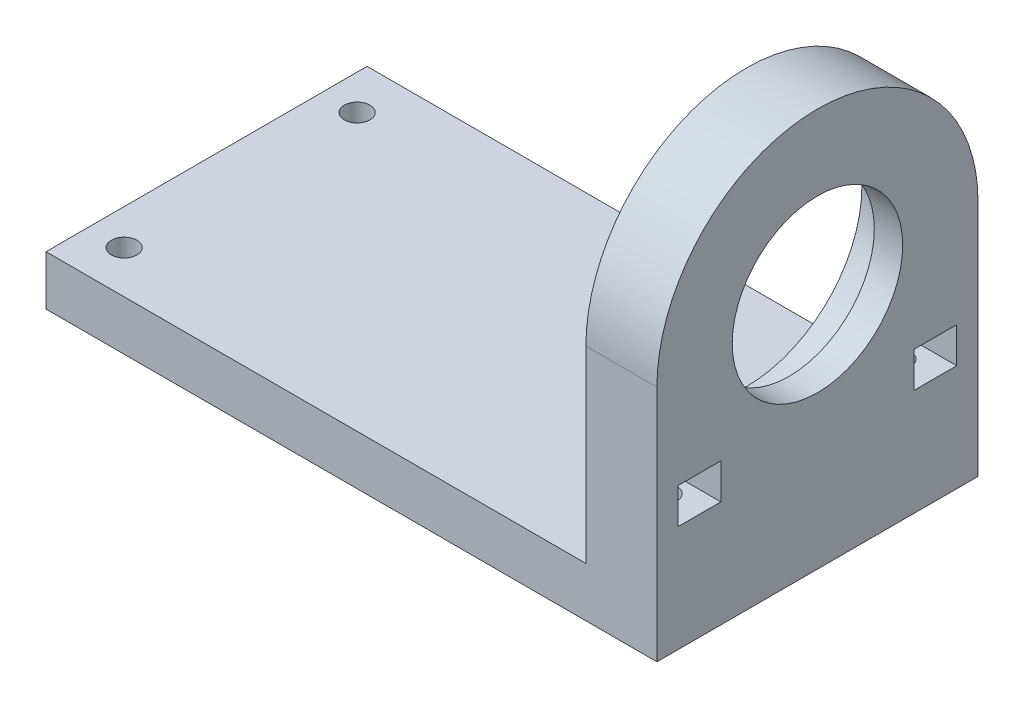
ISO-10303-21;
HEADER;
FILE_DESCRIPTION(('STEP AP214'),'2;1');
FILE_NAME('part.step','',(''),(''),'','','');
FILE_SCHEMA(('AUTOMOTIVE_DESIGN { 1 0 10303 214 1 1 1 1 }'));
ENDSEC;
DATA;
#1=APPLICATION_CONTEXT('core data for automotive mechanical design processes');
#2=APPLICATION_PROTOCOL_DEFINITION('international standard','automotive_design',2000,#1);
#3=PRODUCT_CONTEXT('',#1,'mechanical');
#4=PRODUCT('Part','Part','',(#3));
#5=PRODUCT_RELATED_PRODUCT_CATEGORY('part','',(#4));
#6=PRODUCT_DEFINITION_FORMATION('','',#4);
#7=PRODUCT_DEFINITION_CONTEXT('part definition',#1,'design');
#8=PRODUCT_DEFINITION('design','',#6,#7);
#9=PRODUCT_DEFINITION_SHAPE('','',#8);
#10=(LENGTH_UNIT() NAMED_UNIT(*) SI_UNIT(.MILLI.,.METRE.));
#11=(NAMED_UNIT(*) PLANE_ANGLE_UNIT() SI_UNIT($,.RADIAN.));
#12=(NAMED_UNIT(*) SI_UNIT($,.STERADIAN.) SOLID_ANGLE_UNIT());
#13=UNCERTAINTY_MEASURE_WITH_UNIT(LENGTH_MEASURE(1.E-05),#10,'distance_accuracy_value','');
#14=(GEOMETRIC_REPRESENTATION_CONTEXT(3) GLOBAL_UNCERTAINTY_ASSIGNED_CONTEXT((#13)) GLOBAL_UNIT_ASSIGNED_CONTEXT((#10,
#11,#12)) REPRESENTATION_CONTEXT('',''));
#15=CARTESIAN_POINT('',(0.,0.,0.));
#16=DIRECTION('',(0.,0.,1.));
#17=DIRECTION('',(1.,0.,0.));
#18=AXIS2_PLACEMENT_3D('',#15,#16,#17);
#19=CARTESIAN_POINT('',(-38.0669193591551,20.,-12.8700518012771));
#20=DIRECTION('',(0.,-1.,0.));
#21=DIRECTION('',(0.,0.,-1.));
#22=AXIS2_PLACEMENT_3D('',#19,#20,#21);
#23=CYLINDRICAL_SURFACE('',#22,1.8);
#24=CARTESIAN_POINT('',(-38.0669193591551,7.,-12.8700518012771));
#25=DIRECTION('',(0.,-1.,0.));
#26=DIRECTION('',(0.,0.,-1.));
#27=AXIS2_PLACEMENT_3D('',#24,#25,#26);
#28=CIRCLE('',#27,1.8);
#29=CARTESIAN_POINT('',(-38.0669193591551,7.,-14.6700518012771));
#30=VERTEX_POINT('',#29);
#31=EDGE_CURVE('E333',#30,#30,#28,.T.);
#32=ORIENTED_EDGE('',*,*,#31,.F.);
#33=EDGE_LOOP('',(#32));
#34=FACE_BOUND('',#33,.T.);
#35=CARTESIAN_POINT('',(-38.0669193591551,3.5,-12.8700518012771));
#36=DIRECTION('',(0.,-1.,0.));
#37=DIRECTION('',(0.,0.,-1.));
#38=AXIS2_PLACEMENT_3D('',#35,#36,#37);
#39=CIRCLE('',#38,1.8);
#40=CARTESIAN_POINT('',(-38.0669193591551,3.5,-14.6700518012771));
#41=VERTEX_POINT('',#40);
#42=EDGE_CURVE('E45',#41,#41,#39,.F.);
#43=ORIENTED_EDGE('',*,*,#42,.F.);
#44=EDGE_LOOP('',(#43));
#45=FACE_BOUND('',#44,.T.);
#46=ADVANCED_FACE('F41',(#34,#45),#23,.F.);
#47=CARTESIAN_POINT('',(38.0669193591551,20.,-12.8700518012771));
#48=DIRECTION('',(0.,-1.,0.));
#49=DIRECTION('',(0.,0.,-1.));
#50=AXIS2_PLACEMENT_3D('',#47,#48,#49);
#51=CYLINDRICAL_SURFACE('',#50,1.8);
#52=CARTESIAN_POINT('',(38.0669193591551,15.,-12.8700518012771));
#53=DIRECTION('',(0.,-1.,0.));
#54=DIRECTION('',(0.,0.,-1.));
#55=AXIS2_PLACEMENT_3D('',#52,#53,#54);
#56=CIRCLE('',#55,1.8);
#57=CARTESIAN_POINT('',(38.0669193591551,15.,-14.6700518012771));
#58=VERTEX_POINT('',#57);
#59=EDGE_CURVE('E315',#58,#58,#56,.F.);
#60=ORIENTED_EDGE('',*,*,#59,.T.);
#61=EDGE_LOOP('',(#60));
#62=FACE_BOUND('',#61,.T.);
#63=CARTESIAN_POINT('',(38.0669193591551,3.5,-12.8700518012771));
#64=DIRECTION('',(0.,-1.,0.));
#65=DIRECTION('',(0.,0.,-1.));
#66=AXIS2_PLACEMENT_3D('',#63,#64,#65);
#67=CIRCLE('',#66,1.8);
#68=CARTESIAN_POINT('',(38.0669193591551,3.5,-14.6700518012771));
#69=VERTEX_POINT('',#68);
#70=EDGE_CURVE('E320',#69,#69,#67,.T.);
#71=ORIENTED_EDGE('',*,*,#70,.T.);
#72=EDGE_LOOP('',(#71));
#73=FACE_BOUND('',#72,.T.);
#74=ADVANCED_FACE('F401',(#62,#73),#51,.F.);
#75=CARTESIAN_POINT('',(33.,33.5,3.4));
#76=DIRECTION('',(1.,0.,0.));
#77=DIRECTION('',(0.,0.,-1.));
#78=AXIS2_PLACEMENT_3D('',#75,#76,#77);
#79=CYLINDRICAL_SURFACE('',#78,12.);
#80=CARTESIAN_POINT('',(43.,33.5,3.4));
#81=DIRECTION('',(1.,0.,0.));
#82=DIRECTION('',(0.,0.,-1.));
#83=AXIS2_PLACEMENT_3D('',#80,#81,#82);
#84=CIRCLE('',#83,12.);
#85=CARTESIAN_POINT('',(43.,33.5,-8.6));
#86=VERTEX_POINT('',#85);
#87=EDGE_CURVE('E237',#86,#86,#84,.T.);
#88=ORIENTED_EDGE('',*,*,#87,.T.);
#89=EDGE_LOOP('',(#88));
#90=FACE_BOUND('',#89,.T.);
#91=CARTESIAN_POINT('',(39.,33.5,3.4));
#92=DIRECTION('',(-1.,0.,0.));
#93=DIRECTION('',(0.,0.,1.));
#94=AXIS2_PLACEMENT_3D('',#91,#92,#93);
#95=CIRCLE('',#94,12.);
#96=CARTESIAN_POINT('',(39.,33.5,15.4));
#97=VERTEX_POINT('',#96);
#98=EDGE_CURVE('E188',#97,#97,#95,.F.);
#99=ORIENTED_EDGE('',*,*,#98,.F.);
#100=EDGE_LOOP('',(#99));
#101=FACE_BOUND('',#100,.T.);
#102=ADVANCED_FACE('F407',(#90,#101),#79,.F.);
#103=CARTESIAN_POINT('',(0.,7.,0.));
#104=DIRECTION('',(0.,-1.,0.));
#105=DIRECTION('',(0.,0.,-1.));
#106=AXIS2_PLACEMENT_3D('',#103,#104,#105);
#107=PLANE('',#106);
#108=CARTESIAN_POINT('',(-38.,7.,20.));
#109=DIRECTION('',(0.,-1.,0.));
#110=DIRECTION('',(0.,0.,-1.));
#111=AXIS2_PLACEMENT_3D('',#108,#109,#110);
#112=CIRCLE('',#111,1.8);
#113=CARTESIAN_POINT('',(-38.,7.,18.2));
#114=VERTEX_POINT('',#113);
#115=EDGE_CURVE('E354',#114,#114,#112,.T.);
#116=ORIENTED_EDGE('',*,*,#115,.T.);
#117=EDGE_LOOP('',(#116));
#118=FACE_BOUND('',#117,.T.);
#119=ORIENTED_EDGE('',*,*,#31,.T.);
#120=EDGE_LOOP('',(#119));
#121=FACE_BOUND('',#120,.T.);
#122=DIRECTION('',(0.,0.,1.));
#123=VECTOR('',#122,1.);
#124=CARTESIAN_POINT('',(33.,7.,0.));
#125=LINE('',#124,#123);
#126=CARTESIAN_POINT('',(33.,7.,-19.2));
#127=VERTEX_POINT('',#126);
#128=CARTESIAN_POINT('',(33.,7.,26.));
#129=VERTEX_POINT('',#128);
#130=EDGE_CURVE('E59',#127,#129,#125,.T.);
#131=ORIENTED_EDGE('',*,*,#130,.F.);
#132=DIRECTION('',(-1.,0.,0.));
#133=VECTOR('',#132,1.);
#134=CARTESIAN_POINT('',(-43.,7.,-19.2));
#135=LINE('',#134,#133);
#136=CARTESIAN_POINT('',(-43.,7.,-19.2));
#137=VERTEX_POINT('',#136);
#138=EDGE_CURVE('E282',#127,#137,#135,.T.);
#139=ORIENTED_EDGE('',*,*,#138,.T.);
#140=DIRECTION('',(0.,0.,1.));
#141=VECTOR('',#140,1.);
#142=CARTESIAN_POINT('',(-43.,7.,26.));
#143=LINE('',#142,#141);
#144=CARTESIAN_POINT('',(-43.,7.,26.));
#145=VERTEX_POINT('',#144);
#146=EDGE_CURVE('E276',#137,#145,#143,.T.);
#147=ORIENTED_EDGE('',*,*,#146,.T.);
#148=DIRECTION('',(1.,0.,0.));
#149=VECTOR('',#148,1.);
#150=CARTESIAN_POINT('',(-43.,7.,26.));
#151=LINE('',#150,#149);
#152=EDGE_CURVE('E64',#145,#129,#151,.T.);
#153=ORIENTED_EDGE('',*,*,#152,.T.);
#154=EDGE_LOOP('',(#131,#139,#147,#153));
#155=FACE_BOUND('',#154,.T.);
#156=ADVANCED_FACE('F469',(#118,#121,#155),#107,.F.);
#157=CARTESIAN_POINT('',(-43.,7.,26.));
#158=DIRECTION('',(1.,0.,0.));
#159=DIRECTION('',(0.,0.,-1.));
#160=AXIS2_PLACEMENT_3D('',#157,#158,#159);
#161=PLANE('',#160);
#162=DIRECTION('',(0.,0.,1.));
#163=VECTOR('',#162,1.);
#164=CARTESIAN_POINT('',(-43.,0.,26.));
#165=LINE('',#164,#163);
#166=CARTESIAN_POINT('',(-43.,0.,-19.2));
#167=VERTEX_POINT('',#166);
#168=CARTESIAN_POINT('',(-43.,0.,26.));
#169=VERTEX_POINT('',#168);
#170=EDGE_CURVE('E275',#167,#169,#165,.T.);
#171=ORIENTED_EDGE('',*,*,#170,.T.);
#172=DIRECTION('',(0.,-1.,0.));
#173=VECTOR('',#172,1.);
#174=CARTESIAN_POINT('',(-43.,7.,26.));
#175=LINE('',#174,#173);
#176=EDGE_CURVE('E11',#145,#169,#175,.T.);
#177=ORIENTED_EDGE('',*,*,#176,.F.);
#178=ORIENTED_EDGE('',*,*,#146,.F.);
#179=DIRECTION('',(0.,-1.,0.));
#180=VECTOR('',#179,1.);
#181=CARTESIAN_POINT('',(-43.,7.,-19.2));
#182=LINE('',#181,#180);
#183=EDGE_CURVE('E285',#137,#167,#182,.T.);
#184=ORIENTED_EDGE('',*,*,#183,.T.);
#185=EDGE_LOOP('',(#171,#177,#178,#184));
#186=FACE_BOUND('',#185,.T.);
#187=ADVANCED_FACE('F43',(#186),#161,.F.);
#188=CARTESIAN_POINT('',(-43.,7.,26.));
#189=DIRECTION('',(0.,0.,-1.));
#190=DIRECTION('',(-1.,0.,0.));
#191=AXIS2_PLACEMENT_3D('',#188,#189,#190);
#192=PLANE('',#191);
#193=DIRECTION('',(0.,-1.,0.));
#194=VECTOR('',#193,1.);
#195=CARTESIAN_POINT('',(43.,7.,26.));
#196=LINE('',#195,#194);
#197=CARTESIAN_POINT('',(43.,33.5,26.));
#198=VERTEX_POINT('',#197);
#199=CARTESIAN_POINT('',(43.,0.,26.));
#200=VERTEX_POINT('',#199);
#201=EDGE_CURVE('E51',#198,#200,#196,.T.);
#202=ORIENTED_EDGE('',*,*,#201,.F.);
#203=DIRECTION('',(1.,0.,0.));
#204=VECTOR('',#203,1.);
#205=CARTESIAN_POINT('',(33.,33.5,26.));
#206=LINE('',#205,#204);
#207=CARTESIAN_POINT('',(33.,33.5,26.));
#208=VERTEX_POINT('',#207);
#209=EDGE_CURVE('E266',#208,#198,#206,.T.);
#210=ORIENTED_EDGE('',*,*,#209,.F.);
#211=DIRECTION('',(0.,-1.,0.));
#212=VECTOR('',#211,1.);
#213=CARTESIAN_POINT('',(33.,0.,26.));
#214=LINE('',#213,#212);
#215=EDGE_CURVE('E258',#208,#129,#214,.T.);
#216=ORIENTED_EDGE('',*,*,#215,.T.);
#217=ORIENTED_EDGE('',*,*,#152,.F.);
#218=ORIENTED_EDGE('',*,*,#176,.T.);
#219=DIRECTION('',(1.,0.,0.));
#220=VECTOR('',#219,1.);
#221=CARTESIAN_POINT('',(-43.,0.,26.));
#222=LINE('',#221,#220);
#223=EDGE_CURVE('E289',#169,#200,#222,.T.);
#224=ORIENTED_EDGE('',*,*,#223,.T.);
#225=EDGE_LOOP('',(#202,#210,#216,#217,#218,#224));
#226=FACE_BOUND('',#225,.T.);
#227=ADVANCED_FACE('F484',(#226),#192,.F.);
#228=CARTESIAN_POINT('',(43.,7.,26.));
#229=DIRECTION('',(-1.,0.,0.));
#230=DIRECTION('',(0.,0.,1.));
#231=AXIS2_PLACEMENT_3D('',#228,#229,#230);
#232=PLANE('',#231);
#233=DIRECTION('',(0.,0.,-1.));
#234=VECTOR('',#233,1.);
#235=CARTESIAN_POINT('',(43.,0.,26.));
#236=LINE('',#235,#234);
#237=CARTESIAN_POINT('',(43.,0.,-19.2));
#238=VERTEX_POINT('',#237);
#239=EDGE_CURVE('E292',#200,#238,#236,.T.);
#240=ORIENTED_EDGE('',*,*,#239,.T.);
#241=DIRECTION('',(0.,-1.,0.));
#242=VECTOR('',#241,1.);
#243=CARTESIAN_POINT('',(43.,7.,-19.2));
#244=LINE('',#243,#242);
#245=CARTESIAN_POINT('',(43.,33.5,-19.2));
#246=VERTEX_POINT('',#245);
#247=EDGE_CURVE('E300',#246,#238,#244,.T.);
#248=ORIENTED_EDGE('',*,*,#247,.F.);
#249=CARTESIAN_POINT('',(43.,33.5,3.4));
#250=DIRECTION('',(1.,0.,0.));
#251=DIRECTION('',(0.,0.,-1.));
#252=AXIS2_PLACEMENT_3D('',#249,#250,#251);
#253=CIRCLE('',#252,22.6);
#254=EDGE_CURVE('E250',#246,#198,#253,.T.);
#255=ORIENTED_EDGE('',*,*,#254,.T.);
#256=ORIENTED_EDGE('',*,*,#201,.T.);
#257=EDGE_LOOP('',(#240,#248,#255,#256));
#258=FACE_BOUND('',#257,.T.);
#259=ORIENTED_EDGE('',*,*,#87,.F.);
#260=EDGE_LOOP('',(#259));
#261=FACE_BOUND('',#260,.T.);
#262=DIRECTION('',(0.,-1.,0.));
#263=VECTOR('',#262,1.);
#264=CARTESIAN_POINT('',(43.,15.,23.));
#265=LINE('',#264,#263);
#266=CARTESIAN_POINT('',(43.,20.,23.));
#267=VERTEX_POINT('',#266);
#268=CARTESIAN_POINT('',(43.,15.,23.));
#269=VERTEX_POINT('',#268);
#270=EDGE_CURVE('E197',#267,#269,#265,.T.);
#271=ORIENTED_EDGE('',*,*,#270,.F.);
#272=DIRECTION('',(0.,0.,1.));
#273=VECTOR('',#272,1.);
#274=CARTESIAN_POINT('',(43.,20.,23.));
#275=LINE('',#274,#273);
#276=CARTESIAN_POINT('',(43.,20.,17.));
#277=VERTEX_POINT('',#276);
#278=EDGE_CURVE('E208',#277,#267,#275,.T.);
#279=ORIENTED_EDGE('',*,*,#278,.F.);
#280=DIRECTION('',(0.,1.,0.));
#281=VECTOR('',#280,1.);
#282=CARTESIAN_POINT('',(43.,15.,17.));
#283=LINE('',#282,#281);
#284=CARTESIAN_POINT('',(43.,15.,17.));
#285=VERTEX_POINT('',#284);
#286=EDGE_CURVE('E227',#285,#277,#283,.T.);
#287=ORIENTED_EDGE('',*,*,#286,.F.);
#288=DIRECTION('',(0.,0.,-1.));
#289=VECTOR('',#288,1.);
#290=CARTESIAN_POINT('',(43.,15.,23.));
#291=LINE('',#290,#289);
#292=EDGE_CURVE('E223',#269,#285,#291,.T.);
#293=ORIENTED_EDGE('',*,*,#292,.F.);
#294=EDGE_LOOP('',(#271,#279,#287,#293));
#295=FACE_BOUND('',#294,.T.);
#296=DIRECTION('',(0.,1.,0.));
#297=VECTOR('',#296,1.);
#298=CARTESIAN_POINT('',(43.,15.,-16.2));
#299=LINE('',#298,#297);
#300=CARTESIAN_POINT('',(43.,15.,-16.2));
#301=VERTEX_POINT('',#300);
#302=CARTESIAN_POINT('',(43.,20.,-16.2));
#303=VERTEX_POINT('',#302);
#304=EDGE_CURVE('E150',#301,#303,#299,.T.);
#305=ORIENTED_EDGE('',*,*,#304,.F.);
#306=DIRECTION('',(0.,0.,-1.));
#307=VECTOR('',#306,1.);
#308=CARTESIAN_POINT('',(43.,15.,-16.2));
#309=LINE('',#308,#307);
#310=CARTESIAN_POINT('',(43.,15.,-10.2));
#311=VERTEX_POINT('',#310);
#312=EDGE_CURVE('E171',#311,#301,#309,.T.);
#313=ORIENTED_EDGE('',*,*,#312,.F.);
#314=DIRECTION('',(0.,-1.,0.));
#315=VECTOR('',#314,1.);
#316=CARTESIAN_POINT('',(43.,15.,-10.2));
#317=LINE('',#316,#315);
#318=CARTESIAN_POINT('',(43.,20.,-10.2));
#319=VERTEX_POINT('',#318);
#320=EDGE_CURVE('E175',#319,#311,#317,.T.);
#321=ORIENTED_EDGE('',*,*,#320,.F.);
#322=DIRECTION('',(0.,0.,1.));
#323=VECTOR('',#322,1.);
#324=CARTESIAN_POINT('',(43.,20.,-16.2));
#325=LINE('',#324,#323);
#326=EDGE_CURVE('E187',#303,#319,#325,.T.);
#327=ORIENTED_EDGE('',*,*,#326,.F.);
#328=EDGE_LOOP('',(#305,#313,#321,#327));
#329=FACE_BOUND('',#328,.T.);
#330=ADVANCED_FACE('F481',(#258,#261,#295,#329),#232,.F.);
#331=CARTESIAN_POINT('',(-43.,7.,-19.2));
#332=DIRECTION('',(0.,0.,1.));
#333=DIRECTION('',(1.,0.,0.));
#334=AXIS2_PLACEMENT_3D('',#331,#332,#333);
#335=PLANE('',#334);
#336=DIRECTION('',(-1.,0.,0.));
#337=VECTOR('',#336,1.);
#338=CARTESIAN_POINT('',(-43.,0.,-19.2));
#339=LINE('',#338,#337);
#340=EDGE_CURVE('E279',#238,#167,#339,.T.);
#341=ORIENTED_EDGE('',*,*,#340,.T.);
#342=ORIENTED_EDGE('',*,*,#183,.F.);
#343=ORIENTED_EDGE('',*,*,#138,.F.);
#344=DIRECTION('',(0.,1.,0.));
#345=VECTOR('',#344,1.);
#346=CARTESIAN_POINT('',(33.,0.,-19.2));
#347=LINE('',#346,#345);
#348=CARTESIAN_POINT('',(33.,33.5,-19.2));
#349=VERTEX_POINT('',#348);
#350=EDGE_CURVE('E251',#127,#349,#347,.T.);
#351=ORIENTED_EDGE('',*,*,#350,.T.);
#352=DIRECTION('',(1.,0.,0.));
#353=VECTOR('',#352,1.);
#354=CARTESIAN_POINT('',(33.,33.5,-19.2));
#355=LINE('',#354,#353);
#356=EDGE_CURVE('E262',#349,#246,#355,.T.);
#357=ORIENTED_EDGE('',*,*,#356,.T.);
#358=ORIENTED_EDGE('',*,*,#247,.T.);
#359=EDGE_LOOP('',(#341,#342,#343,#351,#357,#358));
#360=FACE_BOUND('',#359,.T.);
#361=ADVANCED_FACE('F396',(#360),#335,.F.);
#362=CARTESIAN_POINT('',(0.,0.,0.));
#363=DIRECTION('',(0.,-1.,0.));
#364=DIRECTION('',(0.,0.,-1.));
#365=AXIS2_PLACEMENT_3D('',#362,#363,#364);
#366=PLANE('',#365);
#367=CARTESIAN_POINT('',(-38.,0.,20.));
#368=DIRECTION('',(0.,-1.,0.));
#369=DIRECTION('',(0.,0.,1.));
#370=AXIS2_PLACEMENT_3D('',#367,#368,#369);
#371=CIRCLE('',#370,3.5);
#372=CARTESIAN_POINT('',(-38.,0.,23.5));
#373=VERTEX_POINT('',#372);
#374=EDGE_CURVE('E335',#373,#373,#371,.T.);
#375=ORIENTED_EDGE('',*,*,#374,.F.);
#376=EDGE_LOOP('',(#375));
#377=FACE_BOUND('',#376,.T.);
#378=CARTESIAN_POINT('',(-38.,0.,-13.2));
#379=DIRECTION('',(0.,-1.,0.));
#380=DIRECTION('',(0.,0.,-1.));
#381=AXIS2_PLACEMENT_3D('',#378,#379,#380);
#382=CIRCLE('',#381,3.5);
#383=CARTESIAN_POINT('',(-38.,0.,-16.7));
#384=VERTEX_POINT('',#383);
#385=EDGE_CURVE('E347',#384,#384,#382,.T.);
#386=ORIENTED_EDGE('',*,*,#385,.F.);
#387=EDGE_LOOP('',(#386));
#388=FACE_BOUND('',#387,.T.);
#389=CARTESIAN_POINT('',(38.,0.,20.));
#390=DIRECTION('',(0.,1.,0.));
#391=DIRECTION('',(0.,0.,1.));
#392=AXIS2_PLACEMENT_3D('',#389,#390,#391);
#393=CIRCLE('',#392,3.5);
#394=CARTESIAN_POINT('',(38.,0.,23.5));
#395=VERTEX_POINT('',#394);
#396=EDGE_CURVE('E362',#395,#395,#393,.T.);
#397=ORIENTED_EDGE('',*,*,#396,.T.);
#398=EDGE_LOOP('',(#397));
#399=FACE_BOUND('',#398,.T.);
#400=CARTESIAN_POINT('',(38.,0.,-13.2));
#401=DIRECTION('',(0.,1.,0.));
#402=DIRECTION('',(0.,0.,-1.));
#403=AXIS2_PLACEMENT_3D('',#400,#401,#402);
#404=CIRCLE('',#403,3.5);
#405=CARTESIAN_POINT('',(38.,0.,-16.7));
#406=VERTEX_POINT('',#405);
#407=EDGE_CURVE('E358',#406,#406,#404,.T.);
#408=ORIENTED_EDGE('',*,*,#407,.T.);
#409=EDGE_LOOP('',(#408));
#410=FACE_BOUND('',#409,.T.);
#411=ORIENTED_EDGE('',*,*,#239,.F.);
#412=ORIENTED_EDGE('',*,*,#223,.F.);
#413=ORIENTED_EDGE('',*,*,#170,.F.);
#414=ORIENTED_EDGE('',*,*,#340,.F.);
#415=EDGE_LOOP('',(#411,#412,#413,#414));
#416=FACE_BOUND('',#415,.T.);
#417=ADVANCED_FACE('F387',(#377,#388,#399,#410,#416),#366,.T.);
#418=CARTESIAN_POINT('',(33.,33.5,3.4));
#419=DIRECTION('',(1.,0.,0.));
#420=DIRECTION('',(0.,0.,-1.));
#421=AXIS2_PLACEMENT_3D('',#418,#419,#420);
#422=PLANE('',#421);
#423=CARTESIAN_POINT('',(33.,33.5,3.4));
#424=DIRECTION('',(-1.,0.,0.));
#425=DIRECTION('',(0.,0.,1.));
#426=AXIS2_PLACEMENT_3D('',#423,#424,#425);
#427=CIRCLE('',#426,16.25);
#428=CARTESIAN_POINT('',(33.,33.5,19.65));
#429=VERTEX_POINT('',#428);
#430=EDGE_CURVE('E178',#429,#429,#427,.T.);
#431=ORIENTED_EDGE('',*,*,#430,.F.);
#432=EDGE_LOOP('',(#431));
#433=FACE_BOUND('',#432,.T.);
#434=DIRECTION('',(0.,0.,-1.));
#435=VECTOR('',#434,1.);
#436=CARTESIAN_POINT('',(33.,15.,-16.2));
#437=LINE('',#436,#435);
#438=CARTESIAN_POINT('',(33.,15.,-10.2));
#439=VERTEX_POINT('',#438);
#440=CARTESIAN_POINT('',(33.,15.,-16.2));
#441=VERTEX_POINT('',#440);
#442=EDGE_CURVE('E156',#439,#441,#437,.T.);
#443=ORIENTED_EDGE('',*,*,#442,.T.);
#444=DIRECTION('',(0.,1.,0.));
#445=VECTOR('',#444,1.);
#446=CARTESIAN_POINT('',(33.,15.,-16.2));
#447=LINE('',#446,#445);
#448=CARTESIAN_POINT('',(33.,20.,-16.2));
#449=VERTEX_POINT('',#448);
#450=EDGE_CURVE('E147',#441,#449,#447,.T.);
#451=ORIENTED_EDGE('',*,*,#450,.T.);
#452=DIRECTION('',(0.,0.,1.));
#453=VECTOR('',#452,1.);
#454=CARTESIAN_POINT('',(33.,20.,-16.2));
#455=LINE('',#454,#453);
#456=CARTESIAN_POINT('',(33.,20.,-10.2));
#457=VERTEX_POINT('',#456);
#458=EDGE_CURVE('E160',#449,#457,#455,.T.);
#459=ORIENTED_EDGE('',*,*,#458,.T.);
#460=DIRECTION('',(0.,-1.,0.));
#461=VECTOR('',#460,1.);
#462=CARTESIAN_POINT('',(33.,15.,-10.2));
#463=LINE('',#462,#461);
#464=EDGE_CURVE('E165',#457,#439,#463,.T.);
#465=ORIENTED_EDGE('',*,*,#464,.T.);
#466=EDGE_LOOP('',(#443,#451,#459,#465));
#467=FACE_BOUND('',#466,.T.);
#468=DIRECTION('',(0.,0.,1.));
#469=VECTOR('',#468,1.);
#470=CARTESIAN_POINT('',(33.,20.,23.));
#471=LINE('',#470,#469);
#472=CARTESIAN_POINT('',(33.,20.,17.));
#473=VERTEX_POINT('',#472);
#474=CARTESIAN_POINT('',(33.,20.,23.));
#475=VERTEX_POINT('',#474);
#476=EDGE_CURVE('E216',#473,#475,#471,.T.);
#477=ORIENTED_EDGE('',*,*,#476,.T.);
#478=DIRECTION('',(0.,-1.,0.));
#479=VECTOR('',#478,1.);
#480=CARTESIAN_POINT('',(33.,15.,23.));
#481=LINE('',#480,#479);
#482=CARTESIAN_POINT('',(33.,15.,23.));
#483=VERTEX_POINT('',#482);
#484=EDGE_CURVE('E203',#475,#483,#481,.T.);
#485=ORIENTED_EDGE('',*,*,#484,.T.);
#486=DIRECTION('',(0.,0.,-1.));
#487=VECTOR('',#486,1.);
#488=CARTESIAN_POINT('',(33.,15.,23.));
#489=LINE('',#488,#487);
#490=CARTESIAN_POINT('',(33.,15.,17.));
#491=VERTEX_POINT('',#490);
#492=EDGE_CURVE('E207',#483,#491,#489,.T.);
#493=ORIENTED_EDGE('',*,*,#492,.T.);
#494=DIRECTION('',(0.,1.,0.));
#495=VECTOR('',#494,1.);
#496=CARTESIAN_POINT('',(33.,15.,17.));
#497=LINE('',#496,#495);
#498=EDGE_CURVE('E212',#491,#473,#497,.T.);
#499=ORIENTED_EDGE('',*,*,#498,.T.);
#500=EDGE_LOOP('',(#477,#485,#493,#499));
#501=FACE_BOUND('',#500,.T.);
#502=ORIENTED_EDGE('',*,*,#350,.F.);
#503=ORIENTED_EDGE('',*,*,#130,.T.);
#504=ORIENTED_EDGE('',*,*,#215,.F.);
#505=CARTESIAN_POINT('',(33.,33.5,3.4));
#506=DIRECTION('',(1.,0.,0.));
#507=DIRECTION('',(0.,0.,-1.));
#508=AXIS2_PLACEMENT_3D('',#505,#506,#507);
#509=CIRCLE('',#508,22.6);
#510=EDGE_CURVE('E254',#349,#208,#509,.T.);
#511=ORIENTED_EDGE('',*,*,#510,.F.);
#512=EDGE_LOOP('',(#502,#503,#504,#511));
#513=FACE_BOUND('',#512,.T.);
#514=ADVANCED_FACE('F167',(#433,#467,#501,#513),#422,.F.);
#515=CARTESIAN_POINT('',(33.,33.5,3.4));
#516=DIRECTION('',(1.,0.,0.));
#517=DIRECTION('',(0.,0.,-1.));
#518=AXIS2_PLACEMENT_3D('',#515,#516,#517);
#519=CYLINDRICAL_SURFACE('',#518,22.6);
#520=ORIENTED_EDGE('',*,*,#254,.F.);
#521=ORIENTED_EDGE('',*,*,#356,.F.);
#522=ORIENTED_EDGE('',*,*,#510,.T.);
#523=ORIENTED_EDGE('',*,*,#209,.T.);
#524=EDGE_LOOP('',(#520,#521,#522,#523));
#525=FACE_BOUND('',#524,.T.);
#526=ADVANCED_FACE('F386',(#525),#519,.T.);
#527=CARTESIAN_POINT('',(33.,15.,23.));
#528=DIRECTION('',(0.,0.,1.));
#529=DIRECTION('',(1.,0.,0.));
#530=AXIS2_PLACEMENT_3D('',#527,#528,#529);
#531=PLANE('',#530);
#532=ORIENTED_EDGE('',*,*,#270,.T.);
#533=DIRECTION('',(1.,0.,0.));
#534=VECTOR('',#533,1.);
#535=CARTESIAN_POINT('',(33.,15.,23.));
#536=LINE('',#535,#534);
#537=EDGE_CURVE('E220',#483,#269,#536,.T.);
#538=ORIENTED_EDGE('',*,*,#537,.F.);
#539=ORIENTED_EDGE('',*,*,#484,.F.);
#540=DIRECTION('',(1.,0.,0.));
#541=VECTOR('',#540,1.);
#542=CARTESIAN_POINT('',(33.,20.,23.));
#543=LINE('',#542,#541);
#544=EDGE_CURVE('E234',#475,#267,#543,.T.);
#545=ORIENTED_EDGE('',*,*,#544,.T.);
#546=EDGE_LOOP('',(#532,#538,#539,#545));
#547=FACE_BOUND('',#546,.T.);
#548=ADVANCED_FACE('F393',(#547),#531,.F.);
#549=CARTESIAN_POINT('',(33.,20.,23.));
#550=DIRECTION('',(0.,1.,0.));
#551=DIRECTION('',(0.,0.,1.));
#552=AXIS2_PLACEMENT_3D('',#549,#550,#551);
#553=PLANE('',#552);
#554=ORIENTED_EDGE('',*,*,#278,.T.);
#555=ORIENTED_EDGE('',*,*,#544,.F.);
#556=ORIENTED_EDGE('',*,*,#476,.F.);
#557=DIRECTION('',(1.,0.,0.));
#558=VECTOR('',#557,1.);
#559=CARTESIAN_POINT('',(33.,20.,17.));
#560=LINE('',#559,#558);
#561=EDGE_CURVE('E238',#473,#277,#560,.T.);
#562=ORIENTED_EDGE('',*,*,#561,.T.);
#563=EDGE_LOOP('',(#554,#555,#556,#562));
#564=FACE_BOUND('',#563,.T.);
#565=ADVANCED_FACE('F455',(#564),#553,.F.);
#566=CARTESIAN_POINT('',(33.,15.,17.));
#567=DIRECTION('',(0.,0.,-1.));
#568=DIRECTION('',(-1.,0.,0.));
#569=AXIS2_PLACEMENT_3D('',#566,#567,#568);
#570=PLANE('',#569);
#571=ORIENTED_EDGE('',*,*,#286,.T.);
#572=ORIENTED_EDGE('',*,*,#561,.F.);
#573=ORIENTED_EDGE('',*,*,#498,.F.);
#574=DIRECTION('',(1.,0.,0.));
#575=VECTOR('',#574,1.);
#576=CARTESIAN_POINT('',(33.,15.,17.));
#577=LINE('',#576,#575);
#578=EDGE_CURVE('E241',#491,#285,#577,.T.);
#579=ORIENTED_EDGE('',*,*,#578,.T.);
#580=EDGE_LOOP('',(#571,#572,#573,#579));
#581=FACE_BOUND('',#580,.T.);
#582=ADVANCED_FACE('F458',(#581),#570,.F.);
#583=CARTESIAN_POINT('',(33.,15.,23.));
#584=DIRECTION('',(0.,-1.,0.));
#585=DIRECTION('',(0.,0.,-1.));
#586=AXIS2_PLACEMENT_3D('',#583,#584,#585);
#587=PLANE('',#586);
#588=CARTESIAN_POINT('',(38.,15.,20.));
#589=DIRECTION('',(0.,-1.,0.));
#590=DIRECTION('',(0.,0.,-1.));
#591=AXIS2_PLACEMENT_3D('',#588,#589,#590);
#592=CIRCLE('',#591,1.8);
#593=CARTESIAN_POINT('',(38.,15.,18.2));
#594=VERTEX_POINT('',#593);
#595=EDGE_CURVE('E311',#594,#594,#592,.F.);
#596=ORIENTED_EDGE('',*,*,#595,.F.);
#597=EDGE_LOOP('',(#596));
#598=FACE_BOUND('',#597,.T.);
#599=ORIENTED_EDGE('',*,*,#292,.T.);
#600=ORIENTED_EDGE('',*,*,#578,.F.);
#601=ORIENTED_EDGE('',*,*,#492,.F.);
#602=ORIENTED_EDGE('',*,*,#537,.T.);
#603=EDGE_LOOP('',(#599,#600,#601,#602));
#604=FACE_BOUND('',#603,.T.);
#605=ADVANCED_FACE('F454',(#598,#604),#587,.F.);
#606=CARTESIAN_POINT('',(33.,15.,-16.2));
#607=DIRECTION('',(0.,0.,-1.));
#608=DIRECTION('',(-1.,0.,0.));
#609=AXIS2_PLACEMENT_3D('',#606,#607,#608);
#610=PLANE('',#609);
#611=ORIENTED_EDGE('',*,*,#304,.T.);
#612=DIRECTION('',(1.,0.,0.));
#613=VECTOR('',#612,1.);
#614=CARTESIAN_POINT('',(33.,20.,-16.2));
#615=LINE('',#614,#613);
#616=EDGE_CURVE('E143',#449,#303,#615,.T.);
#617=ORIENTED_EDGE('',*,*,#616,.F.);
#618=ORIENTED_EDGE('',*,*,#450,.F.);
#619=DIRECTION('',(1.,0.,0.));
#620=VECTOR('',#619,1.);
#621=CARTESIAN_POINT('',(33.,15.,-16.2));
#622=LINE('',#621,#620);
#623=EDGE_CURVE('E194',#441,#301,#622,.T.);
#624=ORIENTED_EDGE('',*,*,#623,.T.);
#625=EDGE_LOOP('',(#611,#617,#618,#624));
#626=FACE_BOUND('',#625,.T.);
#627=ADVANCED_FACE('F145',(#626),#610,.F.);
#628=CARTESIAN_POINT('',(33.,15.,-16.2));
#629=DIRECTION('',(0.,-1.,0.));
#630=DIRECTION('',(0.,0.,-1.));
#631=AXIS2_PLACEMENT_3D('',#628,#629,#630);
#632=PLANE('',#631);
#633=ORIENTED_EDGE('',*,*,#59,.F.);
#634=EDGE_LOOP('',(#633));
#635=FACE_BOUND('',#634,.T.);
#636=ORIENTED_EDGE('',*,*,#312,.T.);
#637=ORIENTED_EDGE('',*,*,#623,.F.);
#638=ORIENTED_EDGE('',*,*,#442,.F.);
#639=DIRECTION('',(1.,0.,0.));
#640=VECTOR('',#639,1.);
#641=CARTESIAN_POINT('',(33.,15.,-10.2));
#642=LINE('',#641,#640);
#643=EDGE_CURVE('E198',#439,#311,#642,.T.);
#644=ORIENTED_EDGE('',*,*,#643,.T.);
#645=EDGE_LOOP('',(#636,#637,#638,#644));
#646=FACE_BOUND('',#645,.T.);
#647=ADVANCED_FACE('F442',(#635,#646),#632,.F.);
#648=CARTESIAN_POINT('',(33.,15.,-10.2));
#649=DIRECTION('',(0.,0.,1.));
#650=DIRECTION('',(1.,0.,0.));
#651=AXIS2_PLACEMENT_3D('',#648,#649,#650);
#652=PLANE('',#651);
#653=ORIENTED_EDGE('',*,*,#320,.T.);
#654=ORIENTED_EDGE('',*,*,#643,.F.);
#655=ORIENTED_EDGE('',*,*,#464,.F.);
#656=DIRECTION('',(1.,0.,0.));
#657=VECTOR('',#656,1.);
#658=CARTESIAN_POINT('',(33.,20.,-10.2));
#659=LINE('',#658,#657);
#660=EDGE_CURVE('E155',#457,#319,#659,.T.);
#661=ORIENTED_EDGE('',*,*,#660,.T.);
#662=EDGE_LOOP('',(#653,#654,#655,#661));
#663=FACE_BOUND('',#662,.T.);
#664=ADVANCED_FACE('F445',(#663),#652,.F.);
#665=CARTESIAN_POINT('',(33.,20.,-16.2));
#666=DIRECTION('',(0.,1.,0.));
#667=DIRECTION('',(0.,0.,1.));
#668=AXIS2_PLACEMENT_3D('',#665,#666,#667);
#669=PLANE('',#668);
#670=ORIENTED_EDGE('',*,*,#326,.T.);
#671=ORIENTED_EDGE('',*,*,#660,.F.);
#672=ORIENTED_EDGE('',*,*,#458,.F.);
#673=ORIENTED_EDGE('',*,*,#616,.T.);
#674=EDGE_LOOP('',(#670,#671,#672,#673));
#675=FACE_BOUND('',#674,.T.);
#676=ADVANCED_FACE('F161',(#675),#669,.F.);
#677=CARTESIAN_POINT('',(39.,33.5,3.4));
#678=DIRECTION('',(-1.,0.,0.));
#679=DIRECTION('',(0.,0.,1.));
#680=AXIS2_PLACEMENT_3D('',#677,#678,#679);
#681=PLANE('',#680);
#682=CARTESIAN_POINT('',(39.,33.5,3.4));
#683=DIRECTION('',(-1.,0.,0.));
#684=DIRECTION('',(0.,0.,1.));
#685=AXIS2_PLACEMENT_3D('',#682,#683,#684);
#686=CIRCLE('',#685,16.25);
#687=CARTESIAN_POINT('',(39.,33.5,19.65));
#688=VERTEX_POINT('',#687);
#689=EDGE_CURVE('E310',#688,#688,#686,.T.);
#690=ORIENTED_EDGE('',*,*,#689,.T.);
#691=EDGE_LOOP('',(#690));
#692=FACE_BOUND('',#691,.T.);
#693=ORIENTED_EDGE('',*,*,#98,.T.);
#694=EDGE_LOOP('',(#693));
#695=FACE_BOUND('',#694,.T.);
#696=ADVANCED_FACE('F436',(#692,#695),#681,.T.);
#697=CARTESIAN_POINT('',(39.,33.5,3.4));
#698=DIRECTION('',(-1.,0.,0.));
#699=DIRECTION('',(0.,0.,1.));
#700=AXIS2_PLACEMENT_3D('',#697,#698,#699);
#701=CYLINDRICAL_SURFACE('',#700,16.25);
#702=ORIENTED_EDGE('',*,*,#689,.F.);
#703=EDGE_LOOP('',(#702));
#704=FACE_BOUND('',#703,.T.);
#705=ORIENTED_EDGE('',*,*,#430,.T.);
#706=EDGE_LOOP('',(#705));
#707=FACE_BOUND('',#706,.T.);
#708=ADVANCED_FACE('F383',(#704,#707),#701,.F.);
#709=CARTESIAN_POINT('',(38.,20.,20.));
#710=DIRECTION('',(0.,-1.,0.));
#711=DIRECTION('',(0.,0.,-1.));
#712=AXIS2_PLACEMENT_3D('',#709,#710,#711);
#713=CYLINDRICAL_SURFACE('',#712,1.8);
#714=CARTESIAN_POINT('',(38.,3.5,20.));
#715=DIRECTION('',(0.,1.,0.));
#716=DIRECTION('',(0.,0.,1.));
#717=AXIS2_PLACEMENT_3D('',#714,#715,#716);
#718=CIRCLE('',#717,1.8);
#719=CARTESIAN_POINT('',(38.,3.5,21.8));
#720=VERTEX_POINT('',#719);
#721=EDGE_CURVE('E316',#720,#720,#718,.T.);
#722=ORIENTED_EDGE('',*,*,#721,.F.);
#723=EDGE_LOOP('',(#722));
#724=FACE_BOUND('',#723,.T.);
#725=ORIENTED_EDGE('',*,*,#595,.T.);
#726=EDGE_LOOP('',(#725));
#727=FACE_BOUND('',#726,.T.);
#728=ADVANCED_FACE('F424',(#724,#727),#713,.F.);
#729=CARTESIAN_POINT('',(38.,3.5,20.));
#730=DIRECTION('',(0.,-1.,0.));
#731=DIRECTION('',(0.,0.,-1.));
#732=AXIS2_PLACEMENT_3D('',#729,#730,#731);
#733=CYLINDRICAL_SURFACE('',#732,3.5);
#734=CARTESIAN_POINT('',(38.,3.5,20.));
#735=DIRECTION('',(0.,1.,0.));
#736=DIRECTION('',(0.,0.,1.));
#737=AXIS2_PLACEMENT_3D('',#734,#735,#736);
#738=CIRCLE('',#737,3.5);
#739=CARTESIAN_POINT('',(38.,3.5,23.5));
#740=VERTEX_POINT('',#739);
#741=EDGE_CURVE('E321',#740,#740,#738,.T.);
#742=ORIENTED_EDGE('',*,*,#741,.T.);
#743=EDGE_LOOP('',(#742));
#744=FACE_BOUND('',#743,.T.);
#745=ORIENTED_EDGE('',*,*,#396,.F.);
#746=EDGE_LOOP('',(#745));
#747=FACE_BOUND('',#746,.T.);
#748=ADVANCED_FACE('F420',(#744,#747),#733,.F.);
#749=CARTESIAN_POINT('',(38.,3.5,20.));
#750=DIRECTION('',(0.,1.,0.));
#751=DIRECTION('',(0.,0.,1.));
#752=AXIS2_PLACEMENT_3D('',#749,#750,#751);
#753=PLANE('',#752);
#754=ORIENTED_EDGE('',*,*,#721,.T.);
#755=EDGE_LOOP('',(#754));
#756=FACE_BOUND('',#755,.T.);
#757=ORIENTED_EDGE('',*,*,#741,.F.);
#758=EDGE_LOOP('',(#757));
#759=FACE_BOUND('',#758,.T.);
#760=ADVANCED_FACE('F416',(#756,#759),#753,.F.);
#761=CARTESIAN_POINT('',(38.,3.5,-13.2));
#762=DIRECTION('',(0.,-1.,0.));
#763=DIRECTION('',(0.,0.,-1.));
#764=AXIS2_PLACEMENT_3D('',#761,#762,#763);
#765=CYLINDRICAL_SURFACE('',#764,3.5);
#766=CARTESIAN_POINT('',(38.,3.5,-13.2));
#767=DIRECTION('',(0.,1.,0.));
#768=DIRECTION('',(0.,0.,-1.));
#769=AXIS2_PLACEMENT_3D('',#766,#767,#768);
#770=CIRCLE('',#769,3.5);
#771=CARTESIAN_POINT('',(38.,3.5,-16.7));
#772=VERTEX_POINT('',#771);
#773=EDGE_CURVE('E366',#772,#772,#770,.T.);
#774=ORIENTED_EDGE('',*,*,#773,.T.);
#775=EDGE_LOOP('',(#774));
#776=FACE_BOUND('',#775,.T.);
#777=ORIENTED_EDGE('',*,*,#407,.F.);
#778=EDGE_LOOP('',(#777));
#779=FACE_BOUND('',#778,.T.);
#780=ADVANCED_FACE('F419',(#776,#779),#765,.F.);
#781=CARTESIAN_POINT('',(38.,3.5,-13.2));
#782=DIRECTION('',(0.,-1.,0.));
#783=DIRECTION('',(0.,0.,-1.));
#784=AXIS2_PLACEMENT_3D('',#781,#782,#783);
#785=PLANE('',#784);
#786=ORIENTED_EDGE('',*,*,#70,.F.);
#787=EDGE_LOOP('',(#786));
#788=FACE_BOUND('',#787,.T.);
#789=ORIENTED_EDGE('',*,*,#773,.F.);
#790=EDGE_LOOP('',(#789));
#791=FACE_BOUND('',#790,.T.);
#792=ADVANCED_FACE('F426',(#788,#791),#785,.T.);
#793=CARTESIAN_POINT('',(-38.,20.,20.));
#794=DIRECTION('',(0.,-1.,0.));
#795=DIRECTION('',(0.,0.,-1.));
#796=AXIS2_PLACEMENT_3D('',#793,#794,#795);
#797=CYLINDRICAL_SURFACE('',#796,1.8);
#798=CARTESIAN_POINT('',(-38.,3.5,20.));
#799=DIRECTION('',(0.,1.,0.));
#800=DIRECTION('',(0.,0.,1.));
#801=AXIS2_PLACEMENT_3D('',#798,#799,#800);
#802=CIRCLE('',#801,1.8);
#803=CARTESIAN_POINT('',(-38.,3.5,21.8));
#804=VERTEX_POINT('',#803);
#805=EDGE_CURVE('E324',#804,#804,#802,.F.);
#806=ORIENTED_EDGE('',*,*,#805,.T.);
#807=EDGE_LOOP('',(#806));
#808=FACE_BOUND('',#807,.T.);
#809=ORIENTED_EDGE('',*,*,#115,.F.);
#810=EDGE_LOOP('',(#809));
#811=FACE_BOUND('',#810,.T.);
#812=ADVANCED_FACE('F414',(#808,#811),#797,.F.);
#813=CARTESIAN_POINT('',(-38.,3.5,20.));
#814=DIRECTION('',(0.,1.,0.));
#815=DIRECTION('',(0.,0.,1.));
#816=AXIS2_PLACEMENT_3D('',#813,#814,#815);
#817=PLANE('',#816);
#818=CARTESIAN_POINT('',(-38.,3.5,20.));
#819=DIRECTION('',(0.,-1.,0.));
#820=DIRECTION('',(0.,0.,1.));
#821=AXIS2_PLACEMENT_3D('',#818,#819,#820);
#822=CIRCLE('',#821,3.5);
#823=CARTESIAN_POINT('',(-38.,3.5,23.5));
#824=VERTEX_POINT('',#823);
#825=EDGE_CURVE('E327',#824,#824,#822,.T.);
#826=ORIENTED_EDGE('',*,*,#825,.T.);
#827=EDGE_LOOP('',(#826));
#828=FACE_BOUND('',#827,.T.);
#829=ORIENTED_EDGE('',*,*,#805,.F.);
#830=EDGE_LOOP('',(#829));
#831=FACE_BOUND('',#830,.T.);
#832=ADVANCED_FACE('F623',(#828,#831),#817,.F.);
#833=CARTESIAN_POINT('',(-38.,3.5,20.));
#834=DIRECTION('',(0.,-1.,0.));
#835=DIRECTION('',(0.,0.,-1.));
#836=AXIS2_PLACEMENT_3D('',#833,#834,#835);
#837=CYLINDRICAL_SURFACE('',#836,3.5);
#838=ORIENTED_EDGE('',*,*,#825,.F.);
#839=EDGE_LOOP('',(#838));
#840=FACE_BOUND('',#839,.T.);
#841=ORIENTED_EDGE('',*,*,#374,.T.);
#842=EDGE_LOOP('',(#841));
#843=FACE_BOUND('',#842,.T.);
#844=ADVANCED_FACE('F630',(#840,#843),#837,.F.);
#845=CARTESIAN_POINT('',(-38.,3.5,-13.2));
#846=DIRECTION('',(0.,-1.,0.));
#847=DIRECTION('',(0.,0.,-1.));
#848=AXIS2_PLACEMENT_3D('',#845,#846,#847);
#849=PLANE('',#848);
#850=CARTESIAN_POINT('',(-38.,3.5,-13.2));
#851=DIRECTION('',(0.,-1.,0.));
#852=DIRECTION('',(0.,0.,-1.));
#853=AXIS2_PLACEMENT_3D('',#850,#851,#852);
#854=CIRCLE('',#853,3.5);
#855=CARTESIAN_POINT('',(-38.,3.5,-16.7));
#856=VERTEX_POINT('',#855);
#857=EDGE_CURVE('E341',#856,#856,#854,.T.);
#858=ORIENTED_EDGE('',*,*,#857,.T.);
#859=EDGE_LOOP('',(#858));
#860=FACE_BOUND('',#859,.T.);
#861=ORIENTED_EDGE('',*,*,#42,.T.);
#862=EDGE_LOOP('',(#861));
#863=FACE_BOUND('',#862,.T.);
#864=ADVANCED_FACE('F638',(#860,#863),#849,.T.);
#865=CARTESIAN_POINT('',(-38.,3.5,-13.2));
#866=DIRECTION('',(0.,-1.,0.));
#867=DIRECTION('',(0.,0.,-1.));
#868=AXIS2_PLACEMENT_3D('',#865,#866,#867);
#869=CYLINDRICAL_SURFACE('',#868,3.5);
#870=ORIENTED_EDGE('',*,*,#857,.F.);
#871=EDGE_LOOP('',(#870));
#872=FACE_BOUND('',#871,.T.);
#873=ORIENTED_EDGE('',*,*,#385,.T.);
#874=EDGE_LOOP('',(#873));
#875=FACE_BOUND('',#874,.T.);
#876=ADVANCED_FACE('F647',(#872,#875),#869,.F.);
#877=CLOSED_SHELL('',(#46,#74,#102,#156,#187,#227,#330,#361,#417,#514,#526,#548,#565,#582,#605,
#627,#647,#664,#676,#696,#708,#728,#748,#760,#780,#792,#812,#832,#844,#864,#876));
#878=MANIFOLD_SOLID_BREP('B2',#877);
#879=ADVANCED_BREP_SHAPE_REPRESENTATION('',(#18,#878),#14);
#880=SHAPE_DEFINITION_REPRESENTATION(#9,#879);
ENDSEC;
END-ISO-10303-21;
